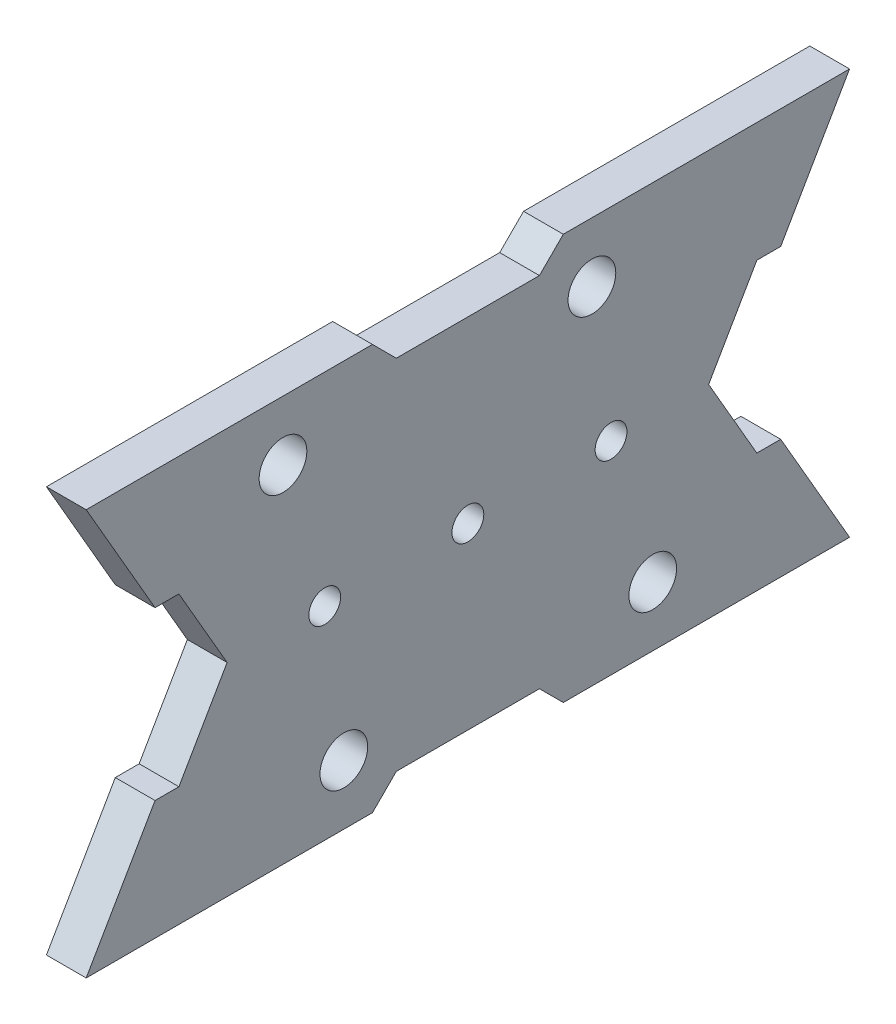
ISO-10303-21;
HEADER;
FILE_DESCRIPTION(('STEP AP214'),'2;1');
FILE_NAME('part.step','',(''),(''),'','','');
FILE_SCHEMA(('AUTOMOTIVE_DESIGN { 1 0 10303 214 1 1 1 1 }'));
ENDSEC;
DATA;
#1=APPLICATION_CONTEXT('core data for automotive mechanical design processes');
#2=APPLICATION_PROTOCOL_DEFINITION('international standard','automotive_design',2000,#1);
#3=PRODUCT_CONTEXT('',#1,'mechanical');
#4=PRODUCT('Part','Part','',(#3));
#5=PRODUCT_RELATED_PRODUCT_CATEGORY('part','',(#4));
#6=PRODUCT_DEFINITION_FORMATION('','',#4);
#7=PRODUCT_DEFINITION_CONTEXT('part definition',#1,'design');
#8=PRODUCT_DEFINITION('design','',#6,#7);
#9=PRODUCT_DEFINITION_SHAPE('','',#8);
#10=(LENGTH_UNIT() NAMED_UNIT(*) SI_UNIT(.MILLI.,.METRE.));
#11=(NAMED_UNIT(*) PLANE_ANGLE_UNIT() SI_UNIT($,.RADIAN.));
#12=(NAMED_UNIT(*) SI_UNIT($,.STERADIAN.) SOLID_ANGLE_UNIT());
#13=UNCERTAINTY_MEASURE_WITH_UNIT(LENGTH_MEASURE(1.E-05),#10,'distance_accuracy_value','');
#14=(GEOMETRIC_REPRESENTATION_CONTEXT(3) GLOBAL_UNCERTAINTY_ASSIGNED_CONTEXT((#13)) GLOBAL_UNIT_ASSIGNED_CONTEXT((#10,
#11,#12)) REPRESENTATION_CONTEXT('',''));
#15=CARTESIAN_POINT('',(0.,0.,0.));
#16=DIRECTION('',(0.,0.,1.));
#17=DIRECTION('',(1.,0.,0.));
#18=AXIS2_PLACEMENT_3D('',#15,#16,#17);
#19=CARTESIAN_POINT('',(5.,0.,0.));
#20=DIRECTION('',(-1.,0.,0.));
#21=DIRECTION('',(0.,0.,1.));
#22=AXIS2_PLACEMENT_3D('',#19,#20,#21);
#23=PLANE('',#22);
#24=DIRECTION('',(0.,0.707106781186549,-0.707106781186546));
#25=VECTOR('',#24,1.);
#26=CARTESIAN_POINT('',(5.,-7.5,-3.59845319237515));
#27=LINE('',#26,#25);
#28=CARTESIAN_POINT('',(5.,-7.5,-3.59845319237515));
#29=VERTEX_POINT('',#28);
#30=CARTESIAN_POINT('',(5.,-4.5,-6.59845319237514));
#31=VERTEX_POINT('',#30);
#32=EDGE_CURVE('E261',#29,#31,#27,.T.);
#33=ORIENTED_EDGE('',*,*,#32,.T.);
#34=DIRECTION('',(0.,0.,-1.));
#35=VECTOR('',#34,1.);
#36=CARTESIAN_POINT('',(5.,-4.5,-6.59845319237514));
#37=LINE('',#36,#35);
#38=CARTESIAN_POINT('',(5.,-4.5,-24.5984531923751));
#39=VERTEX_POINT('',#38);
#40=EDGE_CURVE('E139',#31,#39,#37,.T.);
#41=ORIENTED_EDGE('',*,*,#40,.T.);
#42=DIRECTION('',(0.,-0.707106781186546,-0.707106781186549));
#43=VECTOR('',#42,1.);
#44=CARTESIAN_POINT('',(5.,-4.5,-24.5984531923751));
#45=LINE('',#44,#43);
#46=CARTESIAN_POINT('',(5.,-7.5,-27.5984531923752));
#47=VERTEX_POINT('',#46);
#48=EDGE_CURVE('E318',#39,#47,#45,.T.);
#49=ORIENTED_EDGE('',*,*,#48,.T.);
#50=DIRECTION('',(0.,0.,-1.));
#51=VECTOR('',#50,1.);
#52=CARTESIAN_POINT('',(5.,-7.5,-27.5984531923752));
#53=LINE('',#52,#51);
#54=CARTESIAN_POINT('',(5.,-7.5,-63.5984531923751));
#55=VERTEX_POINT('',#54);
#56=EDGE_CURVE('E337',#47,#55,#53,.T.);
#57=ORIENTED_EDGE('',*,*,#56,.T.);
#58=DIRECTION('',(0.,0.866025403784436,0.500000000000004));
#59=VECTOR('',#58,1.);
#60=CARTESIAN_POINT('',(5.,-7.5,-63.5984531923751));
#61=LINE('',#60,#59);
#62=CARTESIAN_POINT('',(5.,7.50000000000001,-54.9381991545307));
#63=VERTEX_POINT('',#62);
#64=EDGE_CURVE('E334',#55,#63,#61,.T.);
#65=ORIENTED_EDGE('',*,*,#64,.T.);
#66=DIRECTION('',(0.,0.,1.));
#67=VECTOR('',#66,1.);
#68=CARTESIAN_POINT('',(5.,7.50000000000001,-54.9381991545307));
#69=LINE('',#68,#67);
#70=CARTESIAN_POINT('',(5.,7.50000000000001,-51.9381991545307));
#71=VERTEX_POINT('',#70);
#72=EDGE_CURVE('E336',#63,#71,#69,.T.);
#73=ORIENTED_EDGE('',*,*,#72,.T.);
#74=DIRECTION('',(0.,0.866025403784435,0.500000000000006));
#75=VECTOR('',#74,1.);
#76=CARTESIAN_POINT('',(5.,7.50000000000001,-51.9381991545307));
#77=LINE('',#76,#75);
#78=CARTESIAN_POINT('',(5.,18.,-45.8760213280395));
#79=VERTEX_POINT('',#78);
#80=EDGE_CURVE('E339',#71,#79,#77,.T.);
#81=ORIENTED_EDGE('',*,*,#80,.T.);
#82=DIRECTION('',(0.,0.866025403784437,-0.500000000000004));
#83=VECTOR('',#82,1.);
#84=CARTESIAN_POINT('',(5.,18.,-45.8760213280395));
#85=LINE('',#84,#83);
#86=CARTESIAN_POINT('',(5.,28.5,-51.9381991545306));
#87=VERTEX_POINT('',#86);
#88=EDGE_CURVE('E345',#79,#87,#85,.T.);
#89=ORIENTED_EDGE('',*,*,#88,.T.);
#90=DIRECTION('',(0.,0.,-1.));
#91=VECTOR('',#90,1.);
#92=CARTESIAN_POINT('',(5.,28.5,-51.9381991545306));
#93=LINE('',#92,#91);
#94=CARTESIAN_POINT('',(5.,28.5,-54.9381991545306));
#95=VERTEX_POINT('',#94);
#96=EDGE_CURVE('E347',#87,#95,#93,.T.);
#97=ORIENTED_EDGE('',*,*,#96,.T.);
#98=DIRECTION('',(0.,0.866025403784437,-0.500000000000003));
#99=VECTOR('',#98,1.);
#100=CARTESIAN_POINT('',(5.,28.5,-54.9381991545306));
#101=LINE('',#100,#99);
#102=CARTESIAN_POINT('',(5.,43.5,-63.5984531923751));
#103=VERTEX_POINT('',#102);
#104=EDGE_CURVE('E349',#95,#103,#101,.T.);
#105=ORIENTED_EDGE('',*,*,#104,.T.);
#106=DIRECTION('',(0.,0.,1.));
#107=VECTOR('',#106,1.);
#108=CARTESIAN_POINT('',(5.,43.5,-63.5984531923751));
#109=LINE('',#108,#107);
#110=CARTESIAN_POINT('',(5.,43.5,-27.5984531923751));
#111=VERTEX_POINT('',#110);
#112=EDGE_CURVE('E351',#103,#111,#109,.T.);
#113=ORIENTED_EDGE('',*,*,#112,.T.);
#114=DIRECTION('',(0.,-0.707106781186549,0.707106781186546));
#115=VECTOR('',#114,1.);
#116=CARTESIAN_POINT('',(5.,43.5,-27.5984531923751));
#117=LINE('',#116,#115);
#118=CARTESIAN_POINT('',(5.,40.5,-24.5984531923751));
#119=VERTEX_POINT('',#118);
#120=EDGE_CURVE('E353',#111,#119,#117,.T.);
#121=ORIENTED_EDGE('',*,*,#120,.T.);
#122=DIRECTION('',(0.,0.,1.));
#123=VECTOR('',#122,1.);
#124=CARTESIAN_POINT('',(5.,40.5,-24.5984531923751));
#125=LINE('',#124,#123);
#126=CARTESIAN_POINT('',(5.,40.5,-6.59845319237513));
#127=VERTEX_POINT('',#126);
#128=EDGE_CURVE('E355',#119,#127,#125,.T.);
#129=ORIENTED_EDGE('',*,*,#128,.T.);
#130=DIRECTION('',(0.,0.707106781186549,0.707106781186546));
#131=VECTOR('',#130,1.);
#132=CARTESIAN_POINT('',(5.,40.5,-6.59845319237513));
#133=LINE('',#132,#131);
#134=CARTESIAN_POINT('',(5.,43.5,-3.59845319237514));
#135=VERTEX_POINT('',#134);
#136=EDGE_CURVE('E357',#127,#135,#133,.T.);
#137=ORIENTED_EDGE('',*,*,#136,.T.);
#138=DIRECTION('',(0.,0.,1.));
#139=VECTOR('',#138,1.);
#140=CARTESIAN_POINT('',(5.,43.5,-3.59845319237514));
#141=LINE('',#140,#139);
#142=CARTESIAN_POINT('',(5.,43.5,32.4015468076248));
#143=VERTEX_POINT('',#142);
#144=EDGE_CURVE('E359',#135,#143,#141,.T.);
#145=ORIENTED_EDGE('',*,*,#144,.T.);
#146=DIRECTION('',(0.,-0.866025403784436,-0.500000000000004));
#147=VECTOR('',#146,1.);
#148=CARTESIAN_POINT('',(5.,43.5,32.4015468076248));
#149=LINE('',#148,#147);
#150=CARTESIAN_POINT('',(5.,28.5,23.7412927697804));
#151=VERTEX_POINT('',#150);
#152=EDGE_CURVE('E361',#143,#151,#149,.T.);
#153=ORIENTED_EDGE('',*,*,#152,.T.);
#154=DIRECTION('',(0.,0.,-1.));
#155=VECTOR('',#154,1.);
#156=CARTESIAN_POINT('',(5.,28.5,23.7412927697804));
#157=LINE('',#156,#155);
#158=CARTESIAN_POINT('',(5.,28.5,20.7412927697804));
#159=VERTEX_POINT('',#158);
#160=EDGE_CURVE('E363',#151,#159,#157,.T.);
#161=ORIENTED_EDGE('',*,*,#160,.T.);
#162=DIRECTION('',(0.,-0.866025403784435,-0.500000000000005));
#163=VECTOR('',#162,1.);
#164=CARTESIAN_POINT('',(5.,28.5,20.7412927697804));
#165=LINE('',#164,#163);
#166=CARTESIAN_POINT('',(5.,18.,14.6791149432892));
#167=VERTEX_POINT('',#166);
#168=EDGE_CURVE('E365',#159,#167,#165,.T.);
#169=ORIENTED_EDGE('',*,*,#168,.T.);
#170=DIRECTION('',(0.,-0.866025403784436,0.500000000000004));
#171=VECTOR('',#170,1.);
#172=CARTESIAN_POINT('',(5.,18.,14.6791149432892));
#173=LINE('',#172,#171);
#174=CARTESIAN_POINT('',(5.,7.5,20.7412927697804));
#175=VERTEX_POINT('',#174);
#176=EDGE_CURVE('E200',#167,#175,#173,.T.);
#177=ORIENTED_EDGE('',*,*,#176,.T.);
#178=DIRECTION('',(0.,0.,1.));
#179=VECTOR('',#178,1.);
#180=CARTESIAN_POINT('',(5.,7.5,20.7412927697804));
#181=LINE('',#180,#179);
#182=CARTESIAN_POINT('',(5.,7.5,23.7412927697804));
#183=VERTEX_POINT('',#182);
#184=EDGE_CURVE('E194',#175,#183,#181,.T.);
#185=ORIENTED_EDGE('',*,*,#184,.T.);
#186=DIRECTION('',(0.,-0.866025403784436,0.500000000000004));
#187=VECTOR('',#186,1.);
#188=CARTESIAN_POINT('',(5.,7.5,23.7412927697804));
#189=LINE('',#188,#187);
#190=CARTESIAN_POINT('',(5.,-7.5,32.4015468076248));
#191=VERTEX_POINT('',#190);
#192=EDGE_CURVE('E198',#183,#191,#189,.T.);
#193=ORIENTED_EDGE('',*,*,#192,.T.);
#194=DIRECTION('',(0.,0.,-1.));
#195=VECTOR('',#194,1.);
#196=CARTESIAN_POINT('',(5.,-7.5,32.4015468076248));
#197=LINE('',#196,#195);
#198=EDGE_CURVE('E54',#191,#29,#197,.T.);
#199=ORIENTED_EDGE('',*,*,#198,.T.);
#200=EDGE_LOOP('',(#33,#41,#49,#57,#65,#73,#81,#89,#97,#105,#113,#121,#129,#137,#145,#153,#161,
#169,#177,#185,#193,#199));
#201=FACE_BOUND('',#200,.T.);
#202=CARTESIAN_POINT('',(5.,0.,0.));
#203=DIRECTION('',(1.,0.,0.));
#204=DIRECTION('',(0.,0.,-1.));
#205=AXIS2_PLACEMENT_3D('',#202,#203,#204);
#206=CIRCLE('',#205,3.);
#207=CARTESIAN_POINT('',(5.,0.,-3.));
#208=VERTEX_POINT('',#207);
#209=EDGE_CURVE('E222',#208,#208,#206,.T.);
#210=ORIENTED_EDGE('',*,*,#209,.F.);
#211=EDGE_LOOP('',(#210));
#212=FACE_BOUND('',#211,.T.);
#213=CARTESIAN_POINT('',(5.,0.,-38.8489426048712));
#214=DIRECTION('',(1.,0.,0.));
#215=DIRECTION('',(0.,0.,-1.));
#216=AXIS2_PLACEMENT_3D('',#213,#214,#215);
#217=CIRCLE('',#216,2.99999999999999);
#218=CARTESIAN_POINT('',(5.,0.,-41.8489426048712));
#219=VERTEX_POINT('',#218);
#220=EDGE_CURVE('E459',#219,#219,#217,.T.);
#221=ORIENTED_EDGE('',*,*,#220,.F.);
#222=EDGE_LOOP('',(#221));
#223=FACE_BOUND('',#222,.T.);
#224=CARTESIAN_POINT('',(5.,36.,-31.1969063847502));
#225=DIRECTION('',(1.,0.,0.));
#226=DIRECTION('',(0.,0.,-1.));
#227=AXIS2_PLACEMENT_3D('',#224,#225,#226);
#228=CIRCLE('',#227,2.99999999999999);
#229=CARTESIAN_POINT('',(5.,36.,-34.1969063847502));
#230=VERTEX_POINT('',#229);
#231=EDGE_CURVE('E453',#230,#230,#228,.T.);
#232=ORIENTED_EDGE('',*,*,#231,.F.);
#233=EDGE_LOOP('',(#232));
#234=FACE_BOUND('',#233,.T.);
#235=CARTESIAN_POINT('',(5.,36.,7.65203622012092));
#236=DIRECTION('',(1.,0.,0.));
#237=DIRECTION('',(0.,0.,-1.));
#238=AXIS2_PLACEMENT_3D('',#235,#236,#237);
#239=CIRCLE('',#238,3.);
#240=CARTESIAN_POINT('',(5.,36.,4.65203622012092));
#241=VERTEX_POINT('',#240);
#242=EDGE_CURVE('E447',#241,#241,#239,.T.);
#243=ORIENTED_EDGE('',*,*,#242,.F.);
#244=EDGE_LOOP('',(#243));
#245=FACE_BOUND('',#244,.T.);
#246=CARTESIAN_POINT('',(5.,18.,2.40154680762487));
#247=DIRECTION('',(1.,0.,0.));
#248=DIRECTION('',(0.,0.,-1.));
#249=AXIS2_PLACEMENT_3D('',#246,#247,#248);
#250=CIRCLE('',#249,2.);
#251=CARTESIAN_POINT('',(5.,18.,0.401546807624866));
#252=VERTEX_POINT('',#251);
#253=EDGE_CURVE('E441',#252,#252,#250,.T.);
#254=ORIENTED_EDGE('',*,*,#253,.F.);
#255=EDGE_LOOP('',(#254));
#256=FACE_BOUND('',#255,.T.);
#257=CARTESIAN_POINT('',(5.,18.,-33.5984531923751));
#258=DIRECTION('',(1.,0.,0.));
#259=DIRECTION('',(0.,0.,-1.));
#260=AXIS2_PLACEMENT_3D('',#257,#258,#259);
#261=CIRCLE('',#260,2.);
#262=CARTESIAN_POINT('',(5.,18.,-35.5984531923751));
#263=VERTEX_POINT('',#262);
#264=EDGE_CURVE('E435',#263,#263,#261,.T.);
#265=ORIENTED_EDGE('',*,*,#264,.F.);
#266=EDGE_LOOP('',(#265));
#267=FACE_BOUND('',#266,.T.);
#268=CARTESIAN_POINT('',(5.,18.,-15.5984531923751));
#269=DIRECTION('',(1.,0.,0.));
#270=DIRECTION('',(0.,0.,-1.));
#271=AXIS2_PLACEMENT_3D('',#268,#269,#270);
#272=CIRCLE('',#271,2.00000000000001);
#273=CARTESIAN_POINT('',(5.,18.,-17.5984531923751));
#274=VERTEX_POINT('',#273);
#275=EDGE_CURVE('E426',#274,#274,#272,.T.);
#276=ORIENTED_EDGE('',*,*,#275,.F.);
#277=EDGE_LOOP('',(#276));
#278=FACE_BOUND('',#277,.T.);
#279=ADVANCED_FACE('F37',(#201,#212,#223,#234,#245,#256,#267,#278),#23,.F.);
#280=CARTESIAN_POINT('',(0.,0.,0.));
#281=DIRECTION('',(-1.,0.,0.));
#282=DIRECTION('',(0.,0.,1.));
#283=AXIS2_PLACEMENT_3D('',#280,#281,#282);
#284=PLANE('',#283);
#285=CARTESIAN_POINT('',(0.,18.,-33.5984531923751));
#286=DIRECTION('',(1.,0.,0.));
#287=DIRECTION('',(0.,0.,-1.));
#288=AXIS2_PLACEMENT_3D('',#285,#286,#287);
#289=CIRCLE('',#288,2.);
#290=CARTESIAN_POINT('',(0.,18.,-35.5984531923751));
#291=VERTEX_POINT('',#290);
#292=EDGE_CURVE('E432',#291,#291,#289,.T.);
#293=ORIENTED_EDGE('',*,*,#292,.T.);
#294=EDGE_LOOP('',(#293));
#295=FACE_BOUND('',#294,.T.);
#296=CARTESIAN_POINT('',(0.,36.,7.65203622012092));
#297=DIRECTION('',(1.,0.,0.));
#298=DIRECTION('',(0.,0.,-1.));
#299=AXIS2_PLACEMENT_3D('',#296,#297,#298);
#300=CIRCLE('',#299,3.);
#301=CARTESIAN_POINT('',(0.,36.,4.65203622012092));
#302=VERTEX_POINT('',#301);
#303=EDGE_CURVE('E444',#302,#302,#300,.T.);
#304=ORIENTED_EDGE('',*,*,#303,.T.);
#305=EDGE_LOOP('',(#304));
#306=FACE_BOUND('',#305,.T.);
#307=CARTESIAN_POINT('',(0.,0.,-38.8489426048712));
#308=DIRECTION('',(1.,0.,0.));
#309=DIRECTION('',(0.,0.,-1.));
#310=AXIS2_PLACEMENT_3D('',#307,#308,#309);
#311=CIRCLE('',#310,2.99999999999999);
#312=CARTESIAN_POINT('',(0.,0.,-41.8489426048712));
#313=VERTEX_POINT('',#312);
#314=EDGE_CURVE('E456',#313,#313,#311,.T.);
#315=ORIENTED_EDGE('',*,*,#314,.T.);
#316=EDGE_LOOP('',(#315));
#317=FACE_BOUND('',#316,.T.);
#318=DIRECTION('',(0.,0.707106781186549,-0.707106781186546));
#319=VECTOR('',#318,1.);
#320=CARTESIAN_POINT('',(0.,-7.5,-3.59845319237515));
#321=LINE('',#320,#319);
#322=CARTESIAN_POINT('',(0.,-7.5,-3.59845319237515));
#323=VERTEX_POINT('',#322);
#324=CARTESIAN_POINT('',(0.,-4.5,-6.59845319237514));
#325=VERTEX_POINT('',#324);
#326=EDGE_CURVE('E218',#323,#325,#321,.T.);
#327=ORIENTED_EDGE('',*,*,#326,.F.);
#328=DIRECTION('',(0.,0.,-1.));
#329=VECTOR('',#328,1.);
#330=CARTESIAN_POINT('',(0.,-7.5,32.4015468076248));
#331=LINE('',#330,#329);
#332=CARTESIAN_POINT('',(0.,-7.5,32.4015468076248));
#333=VERTEX_POINT('',#332);
#334=EDGE_CURVE('E131',#333,#323,#331,.T.);
#335=ORIENTED_EDGE('',*,*,#334,.F.);
#336=DIRECTION('',(0.,-0.866025403784436,0.500000000000004));
#337=VECTOR('',#336,1.);
#338=CARTESIAN_POINT('',(0.,7.5,23.7412927697804));
#339=LINE('',#338,#337);
#340=CARTESIAN_POINT('',(0.,7.5,23.7412927697804));
#341=VERTEX_POINT('',#340);
#342=EDGE_CURVE('E125',#341,#333,#339,.T.);
#343=ORIENTED_EDGE('',*,*,#342,.F.);
#344=DIRECTION('',(0.,0.,1.));
#345=VECTOR('',#344,1.);
#346=CARTESIAN_POINT('',(0.,7.5,20.7412927697804));
#347=LINE('',#346,#345);
#348=CARTESIAN_POINT('',(0.,7.5,20.7412927697804));
#349=VERTEX_POINT('',#348);
#350=EDGE_CURVE('E208',#349,#341,#347,.T.);
#351=ORIENTED_EDGE('',*,*,#350,.F.);
#352=DIRECTION('',(0.,-0.866025403784436,0.500000000000004));
#353=VECTOR('',#352,1.);
#354=CARTESIAN_POINT('',(0.,18.,14.6791149432892));
#355=LINE('',#354,#353);
#356=CARTESIAN_POINT('',(0.,18.,14.6791149432892));
#357=VERTEX_POINT('',#356);
#358=EDGE_CURVE('E256',#357,#349,#355,.T.);
#359=ORIENTED_EDGE('',*,*,#358,.F.);
#360=DIRECTION('',(0.,-0.866025403784435,-0.500000000000005));
#361=VECTOR('',#360,1.);
#362=CARTESIAN_POINT('',(0.,28.5,20.7412927697804));
#363=LINE('',#362,#361);
#364=CARTESIAN_POINT('',(0.,28.5,20.7412927697804));
#365=VERTEX_POINT('',#364);
#366=EDGE_CURVE('E254',#365,#357,#363,.T.);
#367=ORIENTED_EDGE('',*,*,#366,.F.);
#368=DIRECTION('',(0.,0.,-1.));
#369=VECTOR('',#368,1.);
#370=CARTESIAN_POINT('',(0.,28.5,23.7412927697804));
#371=LINE('',#370,#369);
#372=CARTESIAN_POINT('',(0.,28.5,23.7412927697804));
#373=VERTEX_POINT('',#372);
#374=EDGE_CURVE('E252',#373,#365,#371,.T.);
#375=ORIENTED_EDGE('',*,*,#374,.F.);
#376=DIRECTION('',(0.,-0.866025403784436,-0.500000000000004));
#377=VECTOR('',#376,1.);
#378=CARTESIAN_POINT('',(0.,43.5,32.4015468076248));
#379=LINE('',#378,#377);
#380=CARTESIAN_POINT('',(0.,43.5,32.4015468076248));
#381=VERTEX_POINT('',#380);
#382=EDGE_CURVE('E250',#381,#373,#379,.T.);
#383=ORIENTED_EDGE('',*,*,#382,.F.);
#384=DIRECTION('',(0.,0.,1.));
#385=VECTOR('',#384,1.);
#386=CARTESIAN_POINT('',(0.,43.5,-3.59845319237514));
#387=LINE('',#386,#385);
#388=CARTESIAN_POINT('',(0.,43.5,-3.59845319237514));
#389=VERTEX_POINT('',#388);
#390=EDGE_CURVE('E248',#389,#381,#387,.T.);
#391=ORIENTED_EDGE('',*,*,#390,.F.);
#392=DIRECTION('',(0.,0.707106781186549,0.707106781186546));
#393=VECTOR('',#392,1.);
#394=CARTESIAN_POINT('',(0.,40.5,-6.59845319237513));
#395=LINE('',#394,#393);
#396=CARTESIAN_POINT('',(0.,40.5,-6.59845319237513));
#397=VERTEX_POINT('',#396);
#398=EDGE_CURVE('E246',#397,#389,#395,.T.);
#399=ORIENTED_EDGE('',*,*,#398,.F.);
#400=DIRECTION('',(0.,0.,1.));
#401=VECTOR('',#400,1.);
#402=CARTESIAN_POINT('',(0.,40.5,-24.5984531923751));
#403=LINE('',#402,#401);
#404=CARTESIAN_POINT('',(0.,40.5,-24.5984531923751));
#405=VERTEX_POINT('',#404);
#406=EDGE_CURVE('E244',#405,#397,#403,.T.);
#407=ORIENTED_EDGE('',*,*,#406,.F.);
#408=DIRECTION('',(0.,-0.707106781186549,0.707106781186546));
#409=VECTOR('',#408,1.);
#410=CARTESIAN_POINT('',(0.,43.5,-27.5984531923751));
#411=LINE('',#410,#409);
#412=CARTESIAN_POINT('',(0.,43.5,-27.5984531923751));
#413=VERTEX_POINT('',#412);
#414=EDGE_CURVE('E242',#413,#405,#411,.T.);
#415=ORIENTED_EDGE('',*,*,#414,.F.);
#416=DIRECTION('',(0.,0.,1.));
#417=VECTOR('',#416,1.);
#418=CARTESIAN_POINT('',(0.,43.5,-63.5984531923751));
#419=LINE('',#418,#417);
#420=CARTESIAN_POINT('',(0.,43.5,-63.5984531923751));
#421=VERTEX_POINT('',#420);
#422=EDGE_CURVE('E240',#421,#413,#419,.T.);
#423=ORIENTED_EDGE('',*,*,#422,.F.);
#424=DIRECTION('',(0.,0.866025403784437,-0.500000000000003));
#425=VECTOR('',#424,1.);
#426=CARTESIAN_POINT('',(0.,28.5,-54.9381991545306));
#427=LINE('',#426,#425);
#428=CARTESIAN_POINT('',(0.,28.5,-54.9381991545306));
#429=VERTEX_POINT('',#428);
#430=EDGE_CURVE('E238',#429,#421,#427,.T.);
#431=ORIENTED_EDGE('',*,*,#430,.F.);
#432=DIRECTION('',(0.,0.,-1.));
#433=VECTOR('',#432,1.);
#434=CARTESIAN_POINT('',(0.,28.5,-51.9381991545306));
#435=LINE('',#434,#433);
#436=CARTESIAN_POINT('',(0.,28.5,-51.9381991545306));
#437=VERTEX_POINT('',#436);
#438=EDGE_CURVE('E236',#437,#429,#435,.T.);
#439=ORIENTED_EDGE('',*,*,#438,.F.);
#440=DIRECTION('',(0.,0.866025403784437,-0.500000000000004));
#441=VECTOR('',#440,1.);
#442=CARTESIAN_POINT('',(0.,18.,-45.8760213280395));
#443=LINE('',#442,#441);
#444=CARTESIAN_POINT('',(0.,18.,-45.8760213280395));
#445=VERTEX_POINT('',#444);
#446=EDGE_CURVE('E234',#445,#437,#443,.T.);
#447=ORIENTED_EDGE('',*,*,#446,.F.);
#448=DIRECTION('',(0.,0.866025403784435,0.500000000000006));
#449=VECTOR('',#448,1.);
#450=CARTESIAN_POINT('',(0.,7.50000000000001,-51.9381991545307));
#451=LINE('',#450,#449);
#452=CARTESIAN_POINT('',(0.,7.50000000000001,-51.9381991545307));
#453=VERTEX_POINT('',#452);
#454=EDGE_CURVE('E232',#453,#445,#451,.T.);
#455=ORIENTED_EDGE('',*,*,#454,.F.);
#456=DIRECTION('',(0.,0.,1.));
#457=VECTOR('',#456,1.);
#458=CARTESIAN_POINT('',(0.,7.50000000000001,-54.9381991545307));
#459=LINE('',#458,#457);
#460=CARTESIAN_POINT('',(0.,7.50000000000001,-54.9381991545307));
#461=VERTEX_POINT('',#460);
#462=EDGE_CURVE('E230',#461,#453,#459,.T.);
#463=ORIENTED_EDGE('',*,*,#462,.F.);
#464=DIRECTION('',(0.,0.866025403784436,0.500000000000004));
#465=VECTOR('',#464,1.);
#466=CARTESIAN_POINT('',(0.,-7.5,-63.5984531923751));
#467=LINE('',#466,#465);
#468=CARTESIAN_POINT('',(0.,-7.5,-63.5984531923751));
#469=VERTEX_POINT('',#468);
#470=EDGE_CURVE('E228',#469,#461,#467,.T.);
#471=ORIENTED_EDGE('',*,*,#470,.F.);
#472=DIRECTION('',(0.,0.,-1.));
#473=VECTOR('',#472,1.);
#474=CARTESIAN_POINT('',(0.,-7.5,-27.5984531923752));
#475=LINE('',#474,#473);
#476=CARTESIAN_POINT('',(0.,-7.5,-27.5984531923752));
#477=VERTEX_POINT('',#476);
#478=EDGE_CURVE('E226',#477,#469,#475,.T.);
#479=ORIENTED_EDGE('',*,*,#478,.F.);
#480=DIRECTION('',(0.,-0.707106781186546,-0.707106781186549));
#481=VECTOR('',#480,1.);
#482=CARTESIAN_POINT('',(0.,-4.5,-24.5984531923751));
#483=LINE('',#482,#481);
#484=CARTESIAN_POINT('',(0.,-4.5,-24.5984531923751));
#485=VERTEX_POINT('',#484);
#486=EDGE_CURVE('E224',#485,#477,#483,.T.);
#487=ORIENTED_EDGE('',*,*,#486,.F.);
#488=DIRECTION('',(0.,0.,-1.));
#489=VECTOR('',#488,1.);
#490=CARTESIAN_POINT('',(0.,-4.5,-6.59845319237514));
#491=LINE('',#490,#489);
#492=EDGE_CURVE('E221',#325,#485,#491,.T.);
#493=ORIENTED_EDGE('',*,*,#492,.F.);
#494=EDGE_LOOP('',(#327,#335,#343,#351,#359,#367,#375,#383,#391,#399,#407,#415,#423,#431,#439,
#447,#455,#463,#471,#479,#487,#493));
#495=FACE_BOUND('',#494,.T.);
#496=CARTESIAN_POINT('',(0.,0.,0.));
#497=DIRECTION('',(1.,0.,0.));
#498=DIRECTION('',(0.,0.,-1.));
#499=AXIS2_PLACEMENT_3D('',#496,#497,#498);
#500=CIRCLE('',#499,3.);
#501=CARTESIAN_POINT('',(0.,0.,-3.));
#502=VERTEX_POINT('',#501);
#503=EDGE_CURVE('E462',#502,#502,#500,.T.);
#504=ORIENTED_EDGE('',*,*,#503,.T.);
#505=EDGE_LOOP('',(#504));
#506=FACE_BOUND('',#505,.T.);
#507=CARTESIAN_POINT('',(0.,36.,-31.1969063847502));
#508=DIRECTION('',(1.,0.,0.));
#509=DIRECTION('',(0.,0.,-1.));
#510=AXIS2_PLACEMENT_3D('',#507,#508,#509);
#511=CIRCLE('',#510,2.99999999999999);
#512=CARTESIAN_POINT('',(0.,36.,-34.1969063847502));
#513=VERTEX_POINT('',#512);
#514=EDGE_CURVE('E450',#513,#513,#511,.T.);
#515=ORIENTED_EDGE('',*,*,#514,.T.);
#516=EDGE_LOOP('',(#515));
#517=FACE_BOUND('',#516,.T.);
#518=CARTESIAN_POINT('',(0.,18.,2.40154680762487));
#519=DIRECTION('',(1.,0.,0.));
#520=DIRECTION('',(0.,0.,-1.));
#521=AXIS2_PLACEMENT_3D('',#518,#519,#520);
#522=CIRCLE('',#521,2.);
#523=CARTESIAN_POINT('',(0.,18.,0.401546807624866));
#524=VERTEX_POINT('',#523);
#525=EDGE_CURVE('E438',#524,#524,#522,.T.);
#526=ORIENTED_EDGE('',*,*,#525,.T.);
#527=EDGE_LOOP('',(#526));
#528=FACE_BOUND('',#527,.T.);
#529=CARTESIAN_POINT('',(0.,18.,-15.5984531923751));
#530=DIRECTION('',(1.,0.,0.));
#531=DIRECTION('',(0.,0.,-1.));
#532=AXIS2_PLACEMENT_3D('',#529,#530,#531);
#533=CIRCLE('',#532,2.00000000000001);
#534=CARTESIAN_POINT('',(0.,18.,-17.5984531923751));
#535=VERTEX_POINT('',#534);
#536=EDGE_CURVE('E429',#535,#535,#533,.T.);
#537=ORIENTED_EDGE('',*,*,#536,.T.);
#538=EDGE_LOOP('',(#537));
#539=FACE_BOUND('',#538,.T.);
#540=ADVANCED_FACE('F322',(#295,#306,#317,#495,#506,#517,#528,#539),#284,.T.);
#541=CARTESIAN_POINT('',(5.,-7.5,-3.59845319237515));
#542=DIRECTION('',(0.,0.707106781186546,0.707106781186549));
#543=DIRECTION('',(0.,-0.707106781186549,0.707106781186546));
#544=AXIS2_PLACEMENT_3D('',#541,#542,#543);
#545=PLANE('',#544);
#546=ORIENTED_EDGE('',*,*,#326,.T.);
#547=DIRECTION('',(-1.,0.,0.));
#548=VECTOR('',#547,1.);
#549=CARTESIAN_POINT('',(5.,-4.5,-6.59845319237514));
#550=LINE('',#549,#548);
#551=EDGE_CURVE('E11',#31,#325,#550,.T.);
#552=ORIENTED_EDGE('',*,*,#551,.F.);
#553=ORIENTED_EDGE('',*,*,#32,.F.);
#554=DIRECTION('',(-1.,0.,0.));
#555=VECTOR('',#554,1.);
#556=CARTESIAN_POINT('',(5.,-7.5,-3.59845319237515));
#557=LINE('',#556,#555);
#558=EDGE_CURVE('E214',#29,#323,#557,.T.);
#559=ORIENTED_EDGE('',*,*,#558,.T.);
#560=EDGE_LOOP('',(#546,#552,#553,#559));
#561=FACE_BOUND('',#560,.T.);
#562=ADVANCED_FACE('F39',(#561),#545,.F.);
#563=CARTESIAN_POINT('',(5.,-4.5,-6.59845319237514));
#564=DIRECTION('',(0.,1.,0.));
#565=DIRECTION('',(0.,0.,1.));
#566=AXIS2_PLACEMENT_3D('',#563,#564,#565);
#567=PLANE('',#566);
#568=ORIENTED_EDGE('',*,*,#492,.T.);
#569=DIRECTION('',(-1.,0.,0.));
#570=VECTOR('',#569,1.);
#571=CARTESIAN_POINT('',(5.,-4.5,-24.5984531923751));
#572=LINE('',#571,#570);
#573=EDGE_CURVE('E46',#39,#485,#572,.T.);
#574=ORIENTED_EDGE('',*,*,#573,.F.);
#575=ORIENTED_EDGE('',*,*,#40,.F.);
#576=ORIENTED_EDGE('',*,*,#551,.T.);
#577=EDGE_LOOP('',(#568,#574,#575,#576));
#578=FACE_BOUND('',#577,.T.);
#579=ADVANCED_FACE('F721',(#578),#567,.F.);
#580=CARTESIAN_POINT('',(5.,-4.5,-24.5984531923751));
#581=DIRECTION('',(0.,0.707106781186549,-0.707106781186546));
#582=DIRECTION('',(0.,0.707106781186546,0.707106781186549));
#583=AXIS2_PLACEMENT_3D('',#580,#581,#582);
#584=PLANE('',#583);
#585=ORIENTED_EDGE('',*,*,#486,.T.);
#586=DIRECTION('',(-1.,0.,0.));
#587=VECTOR('',#586,1.);
#588=CARTESIAN_POINT('',(5.,-7.5,-27.5984531923752));
#589=LINE('',#588,#587);
#590=EDGE_CURVE('E310',#47,#477,#589,.T.);
#591=ORIENTED_EDGE('',*,*,#590,.F.);
#592=ORIENTED_EDGE('',*,*,#48,.F.);
#593=ORIENTED_EDGE('',*,*,#573,.T.);
#594=EDGE_LOOP('',(#585,#591,#592,#593));
#595=FACE_BOUND('',#594,.T.);
#596=ADVANCED_FACE('F316',(#595),#584,.F.);
#597=CARTESIAN_POINT('',(5.,-7.5,-27.5984531923752));
#598=DIRECTION('',(0.,1.,0.));
#599=DIRECTION('',(0.,0.,1.));
#600=AXIS2_PLACEMENT_3D('',#597,#598,#599);
#601=PLANE('',#600);
#602=ORIENTED_EDGE('',*,*,#478,.T.);
#603=DIRECTION('',(-1.,0.,0.));
#604=VECTOR('',#603,1.);
#605=CARTESIAN_POINT('',(5.,-7.5,-63.5984531923751));
#606=LINE('',#605,#604);
#607=EDGE_CURVE('E307',#55,#469,#606,.T.);
#608=ORIENTED_EDGE('',*,*,#607,.F.);
#609=ORIENTED_EDGE('',*,*,#56,.F.);
#610=ORIENTED_EDGE('',*,*,#590,.T.);
#611=EDGE_LOOP('',(#602,#608,#609,#610));
#612=FACE_BOUND('',#611,.T.);
#613=ADVANCED_FACE('F328',(#612),#601,.F.);
#614=CARTESIAN_POINT('',(5.,-7.5,-63.5984531923751));
#615=DIRECTION('',(0.,-0.500000000000004,0.866025403784436));
#616=DIRECTION('',(0.,-0.866025403784436,-0.500000000000004));
#617=AXIS2_PLACEMENT_3D('',#614,#615,#616);
#618=PLANE('',#617);
#619=ORIENTED_EDGE('',*,*,#470,.T.);
#620=DIRECTION('',(-1.,0.,0.));
#621=VECTOR('',#620,1.);
#622=CARTESIAN_POINT('',(5.,7.50000000000001,-54.9381991545307));
#623=LINE('',#622,#621);
#624=EDGE_CURVE('E304',#63,#461,#623,.T.);
#625=ORIENTED_EDGE('',*,*,#624,.F.);
#626=ORIENTED_EDGE('',*,*,#64,.F.);
#627=ORIENTED_EDGE('',*,*,#607,.T.);
#628=EDGE_LOOP('',(#619,#625,#626,#627));
#629=FACE_BOUND('',#628,.T.);
#630=ADVANCED_FACE('F332',(#629),#618,.F.);
#631=CARTESIAN_POINT('',(5.,7.50000000000001,-54.9381991545307));
#632=DIRECTION('',(0.,-1.,0.));
#633=DIRECTION('',(0.,0.,-1.));
#634=AXIS2_PLACEMENT_3D('',#631,#632,#633);
#635=PLANE('',#634);
#636=ORIENTED_EDGE('',*,*,#462,.T.);
#637=DIRECTION('',(-1.,0.,0.));
#638=VECTOR('',#637,1.);
#639=CARTESIAN_POINT('',(5.,7.50000000000001,-51.9381991545307));
#640=LINE('',#639,#638);
#641=EDGE_CURVE('E301',#71,#453,#640,.T.);
#642=ORIENTED_EDGE('',*,*,#641,.F.);
#643=ORIENTED_EDGE('',*,*,#72,.F.);
#644=ORIENTED_EDGE('',*,*,#624,.T.);
#645=EDGE_LOOP('',(#636,#642,#643,#644));
#646=FACE_BOUND('',#645,.T.);
#647=ADVANCED_FACE('F682',(#646),#635,.F.);
#648=CARTESIAN_POINT('',(5.,7.50000000000001,-51.9381991545307));
#649=DIRECTION('',(0.,-0.500000000000006,0.866025403784435));
#650=DIRECTION('',(0.,-0.866025403784435,-0.500000000000006));
#651=AXIS2_PLACEMENT_3D('',#648,#649,#650);
#652=PLANE('',#651);
#653=ORIENTED_EDGE('',*,*,#454,.T.);
#654=DIRECTION('',(-1.,0.,0.));
#655=VECTOR('',#654,1.);
#656=CARTESIAN_POINT('',(5.,18.,-45.8760213280395));
#657=LINE('',#656,#655);
#658=EDGE_CURVE('E298',#79,#445,#657,.T.);
#659=ORIENTED_EDGE('',*,*,#658,.F.);
#660=ORIENTED_EDGE('',*,*,#80,.F.);
#661=ORIENTED_EDGE('',*,*,#641,.T.);
#662=EDGE_LOOP('',(#653,#659,#660,#661));
#663=FACE_BOUND('',#662,.T.);
#664=ADVANCED_FACE('F671',(#663),#652,.F.);
#665=CARTESIAN_POINT('',(5.,18.,-45.8760213280395));
#666=DIRECTION('',(0.,0.500000000000004,0.866025403784437));
#667=DIRECTION('',(0.,-0.866025403784437,0.500000000000004));
#668=AXIS2_PLACEMENT_3D('',#665,#666,#667);
#669=PLANE('',#668);
#670=ORIENTED_EDGE('',*,*,#446,.T.);
#671=DIRECTION('',(-1.,0.,0.));
#672=VECTOR('',#671,1.);
#673=CARTESIAN_POINT('',(5.,28.5,-51.9381991545306));
#674=LINE('',#673,#672);
#675=EDGE_CURVE('E295',#87,#437,#674,.T.);
#676=ORIENTED_EDGE('',*,*,#675,.F.);
#677=ORIENTED_EDGE('',*,*,#88,.F.);
#678=ORIENTED_EDGE('',*,*,#658,.T.);
#679=EDGE_LOOP('',(#670,#676,#677,#678));
#680=FACE_BOUND('',#679,.T.);
#681=ADVANCED_FACE('F660',(#680),#669,.F.);
#682=CARTESIAN_POINT('',(5.,28.5,-51.9381991545306));
#683=DIRECTION('',(0.,1.,0.));
#684=DIRECTION('',(0.,0.,1.));
#685=AXIS2_PLACEMENT_3D('',#682,#683,#684);
#686=PLANE('',#685);
#687=ORIENTED_EDGE('',*,*,#438,.T.);
#688=DIRECTION('',(-1.,0.,0.));
#689=VECTOR('',#688,1.);
#690=CARTESIAN_POINT('',(5.,28.5,-54.9381991545306));
#691=LINE('',#690,#689);
#692=EDGE_CURVE('E292',#95,#429,#691,.T.);
#693=ORIENTED_EDGE('',*,*,#692,.F.);
#694=ORIENTED_EDGE('',*,*,#96,.F.);
#695=ORIENTED_EDGE('',*,*,#675,.T.);
#696=EDGE_LOOP('',(#687,#693,#694,#695));
#697=FACE_BOUND('',#696,.T.);
#698=ADVANCED_FACE('F649',(#697),#686,.F.);
#699=CARTESIAN_POINT('',(5.,28.5,-54.9381991545306));
#700=DIRECTION('',(0.,0.500000000000003,0.866025403784437));
#701=DIRECTION('',(0.,-0.866025403784437,0.500000000000003));
#702=AXIS2_PLACEMENT_3D('',#699,#700,#701);
#703=PLANE('',#702);
#704=ORIENTED_EDGE('',*,*,#430,.T.);
#705=DIRECTION('',(-1.,0.,0.));
#706=VECTOR('',#705,1.);
#707=CARTESIAN_POINT('',(5.,43.5,-63.5984531923751));
#708=LINE('',#707,#706);
#709=EDGE_CURVE('E289',#103,#421,#708,.T.);
#710=ORIENTED_EDGE('',*,*,#709,.F.);
#711=ORIENTED_EDGE('',*,*,#104,.F.);
#712=ORIENTED_EDGE('',*,*,#692,.T.);
#713=EDGE_LOOP('',(#704,#710,#711,#712));
#714=FACE_BOUND('',#713,.T.);
#715=ADVANCED_FACE('F638',(#714),#703,.F.);
#716=CARTESIAN_POINT('',(5.,43.5,-63.5984531923751));
#717=DIRECTION('',(0.,-1.,0.));
#718=DIRECTION('',(0.,0.,-1.));
#719=AXIS2_PLACEMENT_3D('',#716,#717,#718);
#720=PLANE('',#719);
#721=ORIENTED_EDGE('',*,*,#422,.T.);
#722=DIRECTION('',(-1.,0.,0.));
#723=VECTOR('',#722,1.);
#724=CARTESIAN_POINT('',(5.,43.5,-27.5984531923751));
#725=LINE('',#724,#723);
#726=EDGE_CURVE('E286',#111,#413,#725,.T.);
#727=ORIENTED_EDGE('',*,*,#726,.F.);
#728=ORIENTED_EDGE('',*,*,#112,.F.);
#729=ORIENTED_EDGE('',*,*,#709,.T.);
#730=EDGE_LOOP('',(#721,#727,#728,#729));
#731=FACE_BOUND('',#730,.T.);
#732=ADVANCED_FACE('F627',(#731),#720,.F.);
#733=CARTESIAN_POINT('',(5.,43.5,-27.5984531923751));
#734=DIRECTION('',(0.,-0.707106781186546,-0.707106781186549));
#735=DIRECTION('',(0.,0.707106781186549,-0.707106781186546));
#736=AXIS2_PLACEMENT_3D('',#733,#734,#735);
#737=PLANE('',#736);
#738=ORIENTED_EDGE('',*,*,#414,.T.);
#739=DIRECTION('',(-1.,0.,0.));
#740=VECTOR('',#739,1.);
#741=CARTESIAN_POINT('',(5.,40.5,-24.5984531923751));
#742=LINE('',#741,#740);
#743=EDGE_CURVE('E283',#119,#405,#742,.T.);
#744=ORIENTED_EDGE('',*,*,#743,.F.);
#745=ORIENTED_EDGE('',*,*,#120,.F.);
#746=ORIENTED_EDGE('',*,*,#726,.T.);
#747=EDGE_LOOP('',(#738,#744,#745,#746));
#748=FACE_BOUND('',#747,.T.);
#749=ADVANCED_FACE('F616',(#748),#737,.F.);
#750=CARTESIAN_POINT('',(5.,40.5,-24.5984531923751));
#751=DIRECTION('',(0.,-1.,0.));
#752=DIRECTION('',(0.,0.,-1.));
#753=AXIS2_PLACEMENT_3D('',#750,#751,#752);
#754=PLANE('',#753);
#755=ORIENTED_EDGE('',*,*,#406,.T.);
#756=DIRECTION('',(-1.,0.,0.));
#757=VECTOR('',#756,1.);
#758=CARTESIAN_POINT('',(5.,40.5,-6.59845319237513));
#759=LINE('',#758,#757);
#760=EDGE_CURVE('E280',#127,#397,#759,.T.);
#761=ORIENTED_EDGE('',*,*,#760,.F.);
#762=ORIENTED_EDGE('',*,*,#128,.F.);
#763=ORIENTED_EDGE('',*,*,#743,.T.);
#764=EDGE_LOOP('',(#755,#761,#762,#763));
#765=FACE_BOUND('',#764,.T.);
#766=ADVANCED_FACE('F605',(#765),#754,.F.);
#767=CARTESIAN_POINT('',(5.,40.5,-6.59845319237513));
#768=DIRECTION('',(0.,-0.707106781186546,0.707106781186549));
#769=DIRECTION('',(0.,-0.707106781186549,-0.707106781186546));
#770=AXIS2_PLACEMENT_3D('',#767,#768,#769);
#771=PLANE('',#770);
#772=ORIENTED_EDGE('',*,*,#398,.T.);
#773=DIRECTION('',(-1.,0.,0.));
#774=VECTOR('',#773,1.);
#775=CARTESIAN_POINT('',(5.,43.5,-3.59845319237514));
#776=LINE('',#775,#774);
#777=EDGE_CURVE('E277',#135,#389,#776,.T.);
#778=ORIENTED_EDGE('',*,*,#777,.F.);
#779=ORIENTED_EDGE('',*,*,#136,.F.);
#780=ORIENTED_EDGE('',*,*,#760,.T.);
#781=EDGE_LOOP('',(#772,#778,#779,#780));
#782=FACE_BOUND('',#781,.T.);
#783=ADVANCED_FACE('F594',(#782),#771,.F.);
#784=CARTESIAN_POINT('',(5.,43.5,-3.59845319237514));
#785=DIRECTION('',(0.,-1.,0.));
#786=DIRECTION('',(0.,0.,-1.));
#787=AXIS2_PLACEMENT_3D('',#784,#785,#786);
#788=PLANE('',#787);
#789=ORIENTED_EDGE('',*,*,#390,.T.);
#790=DIRECTION('',(-1.,0.,0.));
#791=VECTOR('',#790,1.);
#792=CARTESIAN_POINT('',(5.,43.5,32.4015468076248));
#793=LINE('',#792,#791);
#794=EDGE_CURVE('E274',#143,#381,#793,.T.);
#795=ORIENTED_EDGE('',*,*,#794,.F.);
#796=ORIENTED_EDGE('',*,*,#144,.F.);
#797=ORIENTED_EDGE('',*,*,#777,.T.);
#798=EDGE_LOOP('',(#789,#795,#796,#797));
#799=FACE_BOUND('',#798,.T.);
#800=ADVANCED_FACE('F583',(#799),#788,.F.);
#801=CARTESIAN_POINT('',(5.,43.5,32.4015468076248));
#802=DIRECTION('',(0.,0.500000000000004,-0.866025403784436));
#803=DIRECTION('',(0.,0.866025403784436,0.500000000000004));
#804=AXIS2_PLACEMENT_3D('',#801,#802,#803);
#805=PLANE('',#804);
#806=ORIENTED_EDGE('',*,*,#382,.T.);
#807=DIRECTION('',(-1.,0.,0.));
#808=VECTOR('',#807,1.);
#809=CARTESIAN_POINT('',(5.,28.5,23.7412927697804));
#810=LINE('',#809,#808);
#811=EDGE_CURVE('E271',#151,#373,#810,.T.);
#812=ORIENTED_EDGE('',*,*,#811,.F.);
#813=ORIENTED_EDGE('',*,*,#152,.F.);
#814=ORIENTED_EDGE('',*,*,#794,.T.);
#815=EDGE_LOOP('',(#806,#812,#813,#814));
#816=FACE_BOUND('',#815,.T.);
#817=ADVANCED_FACE('F572',(#816),#805,.F.);
#818=CARTESIAN_POINT('',(5.,28.5,23.7412927697804));
#819=DIRECTION('',(0.,1.,0.));
#820=DIRECTION('',(0.,0.,1.));
#821=AXIS2_PLACEMENT_3D('',#818,#819,#820);
#822=PLANE('',#821);
#823=ORIENTED_EDGE('',*,*,#374,.T.);
#824=DIRECTION('',(-1.,0.,0.));
#825=VECTOR('',#824,1.);
#826=CARTESIAN_POINT('',(5.,28.5,20.7412927697804));
#827=LINE('',#826,#825);
#828=EDGE_CURVE('E268',#159,#365,#827,.T.);
#829=ORIENTED_EDGE('',*,*,#828,.F.);
#830=ORIENTED_EDGE('',*,*,#160,.F.);
#831=ORIENTED_EDGE('',*,*,#811,.T.);
#832=EDGE_LOOP('',(#823,#829,#830,#831));
#833=FACE_BOUND('',#832,.T.);
#834=ADVANCED_FACE('F562',(#833),#822,.F.);
#835=CARTESIAN_POINT('',(5.,28.5,20.7412927697804));
#836=DIRECTION('',(0.,0.500000000000005,-0.866025403784435));
#837=DIRECTION('',(0.,0.866025403784436,0.500000000000005));
#838=AXIS2_PLACEMENT_3D('',#835,#836,#837);
#839=PLANE('',#838);
#840=ORIENTED_EDGE('',*,*,#366,.T.);
#841=DIRECTION('',(-1.,0.,0.));
#842=VECTOR('',#841,1.);
#843=CARTESIAN_POINT('',(5.,18.,14.6791149432892));
#844=LINE('',#843,#842);
#845=EDGE_CURVE('E265',#167,#357,#844,.T.);
#846=ORIENTED_EDGE('',*,*,#845,.F.);
#847=ORIENTED_EDGE('',*,*,#168,.F.);
#848=ORIENTED_EDGE('',*,*,#828,.T.);
#849=EDGE_LOOP('',(#840,#846,#847,#848));
#850=FACE_BOUND('',#849,.T.);
#851=ADVANCED_FACE('F371',(#850),#839,.F.);
#852=CARTESIAN_POINT('',(5.,18.,14.6791149432892));
#853=DIRECTION('',(0.,-0.500000000000004,-0.866025403784436));
#854=DIRECTION('',(0.,0.866025403784437,-0.500000000000004));
#855=AXIS2_PLACEMENT_3D('',#852,#853,#854);
#856=PLANE('',#855);
#857=ORIENTED_EDGE('',*,*,#358,.T.);
#858=DIRECTION('',(-1.,0.,0.));
#859=VECTOR('',#858,1.);
#860=CARTESIAN_POINT('',(5.,7.5,20.7412927697804));
#861=LINE('',#860,#859);
#862=EDGE_CURVE('E209',#175,#349,#861,.T.);
#863=ORIENTED_EDGE('',*,*,#862,.F.);
#864=ORIENTED_EDGE('',*,*,#176,.F.);
#865=ORIENTED_EDGE('',*,*,#845,.T.);
#866=EDGE_LOOP('',(#857,#863,#864,#865));
#867=FACE_BOUND('',#866,.T.);
#868=ADVANCED_FACE('F375',(#867),#856,.F.);
#869=CARTESIAN_POINT('',(5.,7.5,20.7412927697804));
#870=DIRECTION('',(0.,-1.,0.));
#871=DIRECTION('',(0.,0.,-1.));
#872=AXIS2_PLACEMENT_3D('',#869,#870,#871);
#873=PLANE('',#872);
#874=ORIENTED_EDGE('',*,*,#350,.T.);
#875=DIRECTION('',(-1.,0.,0.));
#876=VECTOR('',#875,1.);
#877=CARTESIAN_POINT('',(5.,7.5,23.7412927697804));
#878=LINE('',#877,#876);
#879=EDGE_CURVE('E205',#183,#341,#878,.T.);
#880=ORIENTED_EDGE('',*,*,#879,.F.);
#881=ORIENTED_EDGE('',*,*,#184,.F.);
#882=ORIENTED_EDGE('',*,*,#862,.T.);
#883=EDGE_LOOP('',(#874,#880,#881,#882));
#884=FACE_BOUND('',#883,.T.);
#885=ADVANCED_FACE('F206',(#884),#873,.F.);
#886=CARTESIAN_POINT('',(5.,7.5,23.7412927697804));
#887=DIRECTION('',(0.,-0.500000000000004,-0.866025403784436));
#888=DIRECTION('',(0.,0.866025403784436,-0.500000000000004));
#889=AXIS2_PLACEMENT_3D('',#886,#887,#888);
#890=PLANE('',#889);
#891=ORIENTED_EDGE('',*,*,#342,.T.);
#892=DIRECTION('',(-1.,0.,0.));
#893=VECTOR('',#892,1.);
#894=CARTESIAN_POINT('',(5.,-7.5,32.4015468076248));
#895=LINE('',#894,#893);
#896=EDGE_CURVE('E210',#191,#333,#895,.T.);
#897=ORIENTED_EDGE('',*,*,#896,.F.);
#898=ORIENTED_EDGE('',*,*,#192,.F.);
#899=ORIENTED_EDGE('',*,*,#879,.T.);
#900=EDGE_LOOP('',(#891,#897,#898,#899));
#901=FACE_BOUND('',#900,.T.);
#902=ADVANCED_FACE('F212',(#901),#890,.F.);
#903=CARTESIAN_POINT('',(5.,-7.5,32.4015468076248));
#904=DIRECTION('',(0.,1.,0.));
#905=DIRECTION('',(0.,0.,1.));
#906=AXIS2_PLACEMENT_3D('',#903,#904,#905);
#907=PLANE('',#906);
#908=ORIENTED_EDGE('',*,*,#334,.T.);
#909=ORIENTED_EDGE('',*,*,#558,.F.);
#910=ORIENTED_EDGE('',*,*,#198,.F.);
#911=ORIENTED_EDGE('',*,*,#896,.T.);
#912=EDGE_LOOP('',(#908,#909,#910,#911));
#913=FACE_BOUND('',#912,.T.);
#914=ADVANCED_FACE('F379',(#913),#907,.F.);
#915=CARTESIAN_POINT('',(5.,0.,0.));
#916=DIRECTION('',(-1.,0.,0.));
#917=DIRECTION('',(0.,0.,1.));
#918=AXIS2_PLACEMENT_3D('',#915,#916,#917);
#919=CYLINDRICAL_SURFACE('',#918,3.);
#920=ORIENTED_EDGE('',*,*,#209,.T.);
#921=EDGE_LOOP('',(#920));
#922=FACE_BOUND('',#921,.T.);
#923=ORIENTED_EDGE('',*,*,#503,.F.);
#924=EDGE_LOOP('',(#923));
#925=FACE_BOUND('',#924,.T.);
#926=ADVANCED_FACE('F381',(#922,#925),#919,.F.);
#927=CARTESIAN_POINT('',(5.,0.,-38.8489426048712));
#928=DIRECTION('',(-1.,0.,0.));
#929=DIRECTION('',(0.,0.,1.));
#930=AXIS2_PLACEMENT_3D('',#927,#928,#929);
#931=CYLINDRICAL_SURFACE('',#930,2.99999999999999);
#932=ORIENTED_EDGE('',*,*,#220,.T.);
#933=EDGE_LOOP('',(#932));
#934=FACE_BOUND('',#933,.T.);
#935=ORIENTED_EDGE('',*,*,#314,.F.);
#936=EDGE_LOOP('',(#935));
#937=FACE_BOUND('',#936,.T.);
#938=ADVANCED_FACE('F387',(#934,#937),#931,.F.);
#939=CARTESIAN_POINT('',(5.,36.,-31.1969063847502));
#940=DIRECTION('',(-1.,0.,0.));
#941=DIRECTION('',(0.,0.,1.));
#942=AXIS2_PLACEMENT_3D('',#939,#940,#941);
#943=CYLINDRICAL_SURFACE('',#942,2.99999999999999);
#944=ORIENTED_EDGE('',*,*,#231,.T.);
#945=EDGE_LOOP('',(#944));
#946=FACE_BOUND('',#945,.T.);
#947=ORIENTED_EDGE('',*,*,#514,.F.);
#948=EDGE_LOOP('',(#947));
#949=FACE_BOUND('',#948,.T.);
#950=ADVANCED_FACE('F401',(#946,#949),#943,.F.);
#951=CARTESIAN_POINT('',(5.,36.,7.65203622012092));
#952=DIRECTION('',(-1.,0.,0.));
#953=DIRECTION('',(0.,0.,1.));
#954=AXIS2_PLACEMENT_3D('',#951,#952,#953);
#955=CYLINDRICAL_SURFACE('',#954,3.);
#956=ORIENTED_EDGE('',*,*,#242,.T.);
#957=EDGE_LOOP('',(#956));
#958=FACE_BOUND('',#957,.T.);
#959=ORIENTED_EDGE('',*,*,#303,.F.);
#960=EDGE_LOOP('',(#959));
#961=FACE_BOUND('',#960,.T.);
#962=ADVANCED_FACE('F405',(#958,#961),#955,.F.);
#963=CARTESIAN_POINT('',(5.,18.,2.40154680762487));
#964=DIRECTION('',(-1.,0.,0.));
#965=DIRECTION('',(0.,0.,1.));
#966=AXIS2_PLACEMENT_3D('',#963,#964,#965);
#967=CYLINDRICAL_SURFACE('',#966,2.);
#968=ORIENTED_EDGE('',*,*,#253,.T.);
#969=EDGE_LOOP('',(#968));
#970=FACE_BOUND('',#969,.T.);
#971=ORIENTED_EDGE('',*,*,#525,.F.);
#972=EDGE_LOOP('',(#971));
#973=FACE_BOUND('',#972,.T.);
#974=ADVANCED_FACE('F409',(#970,#973),#967,.F.);
#975=CARTESIAN_POINT('',(5.,18.,-33.5984531923751));
#976=DIRECTION('',(-1.,0.,0.));
#977=DIRECTION('',(0.,0.,1.));
#978=AXIS2_PLACEMENT_3D('',#975,#976,#977);
#979=CYLINDRICAL_SURFACE('',#978,2.);
#980=ORIENTED_EDGE('',*,*,#264,.T.);
#981=EDGE_LOOP('',(#980));
#982=FACE_BOUND('',#981,.T.);
#983=ORIENTED_EDGE('',*,*,#292,.F.);
#984=EDGE_LOOP('',(#983));
#985=FACE_BOUND('',#984,.T.);
#986=ADVANCED_FACE('F413',(#982,#985),#979,.F.);
#987=CARTESIAN_POINT('',(5.,18.,-15.5984531923751));
#988=DIRECTION('',(-1.,0.,0.));
#989=DIRECTION('',(0.,0.,1.));
#990=AXIS2_PLACEMENT_3D('',#987,#988,#989);
#991=CYLINDRICAL_SURFACE('',#990,2.00000000000001);
#992=ORIENTED_EDGE('',*,*,#275,.T.);
#993=EDGE_LOOP('',(#992));
#994=FACE_BOUND('',#993,.T.);
#995=ORIENTED_EDGE('',*,*,#536,.F.);
#996=EDGE_LOOP('',(#995));
#997=FACE_BOUND('',#996,.T.);
#998=ADVANCED_FACE('F417',(#994,#997),#991,.F.);
#999=CLOSED_SHELL('',(#279,#540,#562,#579,#596,#613,#630,#647,#664,#681,#698,#715,#732,#749,
#766,#783,#800,#817,#834,#851,#868,#885,#902,#914,#926,#938,#950,#962,#974,#986,#998));
#1000=MANIFOLD_SOLID_BREP('B2',#999);
#1001=ADVANCED_BREP_SHAPE_REPRESENTATION('',(#18,#1000),#14);
#1002=SHAPE_DEFINITION_REPRESENTATION(#9,#1001);
ENDSEC;
END-ISO-10303-21;
